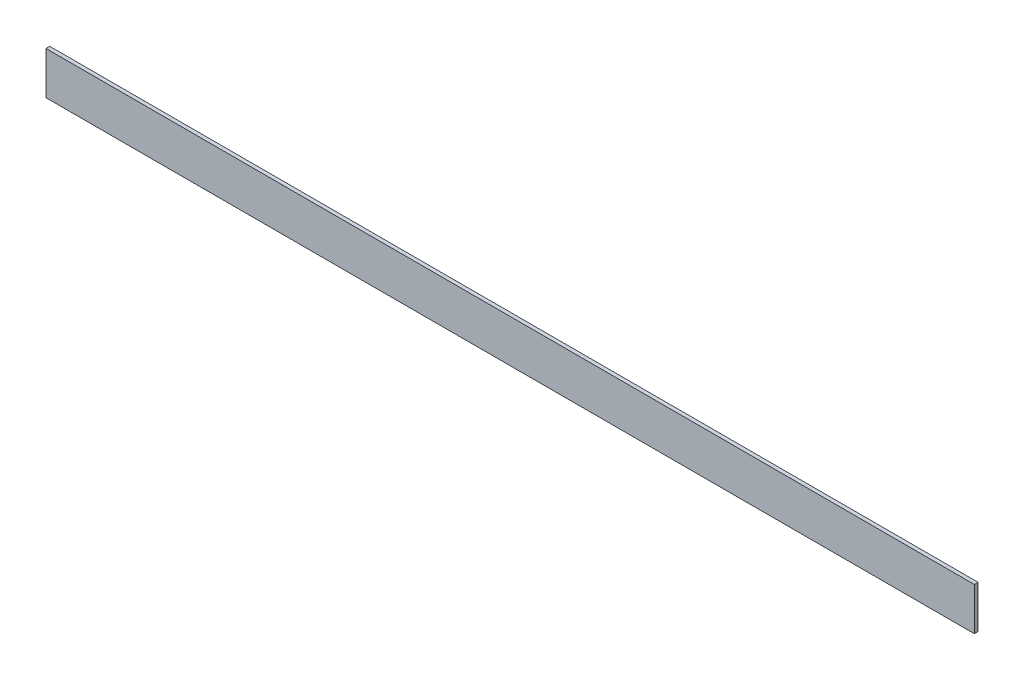
ISO-10303-21;
HEADER;
FILE_DESCRIPTION(('STEP AP214'),'2;1');
FILE_NAME('part.step','',(''),(''),'','','');
FILE_SCHEMA(('AUTOMOTIVE_DESIGN { 1 0 10303 214 1 1 1 1 }'));
ENDSEC;
DATA;
#1=APPLICATION_CONTEXT('core data for automotive mechanical design processes');
#2=APPLICATION_PROTOCOL_DEFINITION('international standard','automotive_design',2000,#1);
#3=PRODUCT_CONTEXT('',#1,'mechanical');
#4=PRODUCT('Part','Part','',(#3));
#5=PRODUCT_RELATED_PRODUCT_CATEGORY('part','',(#4));
#6=PRODUCT_DEFINITION_FORMATION('','',#4);
#7=PRODUCT_DEFINITION_CONTEXT('part definition',#1,'design');
#8=PRODUCT_DEFINITION('design','',#6,#7);
#9=PRODUCT_DEFINITION_SHAPE('','',#8);
#10=(LENGTH_UNIT() NAMED_UNIT(*) SI_UNIT(.MILLI.,.METRE.));
#11=(NAMED_UNIT(*) PLANE_ANGLE_UNIT() SI_UNIT($,.RADIAN.));
#12=(NAMED_UNIT(*) SI_UNIT($,.STERADIAN.) SOLID_ANGLE_UNIT());
#13=UNCERTAINTY_MEASURE_WITH_UNIT(LENGTH_MEASURE(1.E-05),#10,'distance_accuracy_value','');
#14=(GEOMETRIC_REPRESENTATION_CONTEXT(3) GLOBAL_UNCERTAINTY_ASSIGNED_CONTEXT((#13)) GLOBAL_UNIT_ASSIGNED_CONTEXT((#10,
#11,#12)) REPRESENTATION_CONTEXT('',''));
#15=CARTESIAN_POINT('',(0.,0.,0.));
#16=DIRECTION('',(0.,0.,1.));
#17=DIRECTION('',(1.,0.,0.));
#18=AXIS2_PLACEMENT_3D('',#15,#16,#17);
#19=CARTESIAN_POINT('',(2500.,115.,10.));
#20=DIRECTION('',(0.,-1.,0.));
#21=DIRECTION('',(1.,0.,0.));
#22=AXIS2_PLACEMENT_3D('',#19,#20,#21);
#23=PLANE('',#22);
#24=DIRECTION('',(-1.,0.,0.));
#25=VECTOR('',#24,1.);
#26=CARTESIAN_POINT('',(2500.,115.,0.));
#27=LINE('',#26,#25);
#28=CARTESIAN_POINT('',(2500.,115.,0.));
#29=VERTEX_POINT('',#28);
#30=CARTESIAN_POINT('',(0.,115.,0.));
#31=VERTEX_POINT('',#30);
#32=EDGE_CURVE('E107',#29,#31,#27,.T.);
#33=ORIENTED_EDGE('',*,*,#32,.T.);
#34=DIRECTION('',(0.,0.,-1.));
#35=VECTOR('',#34,1.);
#36=CARTESIAN_POINT('',(0.,115.,10.));
#37=LINE('',#36,#35);
#38=CARTESIAN_POINT('',(0.,115.,10.));
#39=VERTEX_POINT('',#38);
#40=EDGE_CURVE('E11',#39,#31,#37,.T.);
#41=ORIENTED_EDGE('',*,*,#40,.F.);
#42=DIRECTION('',(-1.,0.,0.));
#43=VECTOR('',#42,1.);
#44=CARTESIAN_POINT('',(2500.,115.,10.));
#45=LINE('',#44,#43);
#46=CARTESIAN_POINT('',(2500.,115.,10.));
#47=VERTEX_POINT('',#46);
#48=EDGE_CURVE('E91',#47,#39,#45,.T.);
#49=ORIENTED_EDGE('',*,*,#48,.F.);
#50=DIRECTION('',(0.,0.,-1.));
#51=VECTOR('',#50,1.);
#52=CARTESIAN_POINT('',(2500.,115.,10.));
#53=LINE('',#52,#51);
#54=EDGE_CURVE('E103',#47,#29,#53,.T.);
#55=ORIENTED_EDGE('',*,*,#54,.T.);
#56=EDGE_LOOP('',(#33,#41,#49,#55));
#57=FACE_BOUND('',#56,.T.);
#58=ADVANCED_FACE('F39',(#57),#23,.F.);
#59=CARTESIAN_POINT('',(0.,115.,10.));
#60=DIRECTION('',(1.,0.,0.));
#61=DIRECTION('',(0.,1.,0.));
#62=AXIS2_PLACEMENT_3D('',#59,#60,#61);
#63=PLANE('',#62);
#64=DIRECTION('',(0.,-1.,0.));
#65=VECTOR('',#64,1.);
#66=CARTESIAN_POINT('',(0.,115.,0.));
#67=LINE('',#66,#65);
#68=CARTESIAN_POINT('',(0.,0.,0.));
#69=VERTEX_POINT('',#68);
#70=EDGE_CURVE('E96',#31,#69,#67,.T.);
#71=ORIENTED_EDGE('',*,*,#70,.T.);
#72=DIRECTION('',(0.,0.,-1.));
#73=VECTOR('',#72,1.);
#74=CARTESIAN_POINT('',(0.,0.,10.));
#75=LINE('',#74,#73);
#76=CARTESIAN_POINT('',(0.,0.,10.));
#77=VERTEX_POINT('',#76);
#78=EDGE_CURVE('E48',#77,#69,#75,.T.);
#79=ORIENTED_EDGE('',*,*,#78,.F.);
#80=DIRECTION('',(0.,-1.,0.));
#81=VECTOR('',#80,1.);
#82=CARTESIAN_POINT('',(0.,115.,10.));
#83=LINE('',#82,#81);
#84=EDGE_CURVE('E86',#39,#77,#83,.T.);
#85=ORIENTED_EDGE('',*,*,#84,.F.);
#86=ORIENTED_EDGE('',*,*,#40,.T.);
#87=EDGE_LOOP('',(#71,#79,#85,#86));
#88=FACE_BOUND('',#87,.T.);
#89=ADVANCED_FACE('F95',(#88),#63,.F.);
#90=CARTESIAN_POINT('',(2500.,4.59242549680257E-13,10.));
#91=DIRECTION('',(0.,1.,0.));
#92=DIRECTION('',(-1.,0.,0.));
#93=AXIS2_PLACEMENT_3D('',#90,#91,#92);
#94=PLANE('',#93);
#95=DIRECTION('',(1.,0.,0.));
#96=VECTOR('',#95,1.);
#97=CARTESIAN_POINT('',(2500.,4.59242549680257E-13,0.));
#98=LINE('',#97,#96);
#99=CARTESIAN_POINT('',(2500.,4.59242549680257E-13,0.));
#100=VERTEX_POINT('',#99);
#101=EDGE_CURVE('E73',#69,#100,#98,.T.);
#102=ORIENTED_EDGE('',*,*,#101,.T.);
#103=DIRECTION('',(0.,0.,-1.));
#104=VECTOR('',#103,1.);
#105=CARTESIAN_POINT('',(2500.,4.59242549680257E-13,10.));
#106=LINE('',#105,#104);
#107=CARTESIAN_POINT('',(2500.,4.59242549680257E-13,10.));
#108=VERTEX_POINT('',#107);
#109=EDGE_CURVE('E98',#108,#100,#106,.T.);
#110=ORIENTED_EDGE('',*,*,#109,.F.);
#111=DIRECTION('',(1.,0.,0.));
#112=VECTOR('',#111,1.);
#113=CARTESIAN_POINT('',(2500.,4.59242549680257E-13,10.));
#114=LINE('',#113,#112);
#115=EDGE_CURVE('E89',#77,#108,#114,.T.);
#116=ORIENTED_EDGE('',*,*,#115,.F.);
#117=ORIENTED_EDGE('',*,*,#78,.T.);
#118=EDGE_LOOP('',(#102,#110,#116,#117));
#119=FACE_BOUND('',#118,.T.);
#120=ADVANCED_FACE('F99',(#119),#94,.F.);
#121=CARTESIAN_POINT('',(2500.,115.,10.));
#122=DIRECTION('',(-1.,0.,0.));
#123=DIRECTION('',(0.,0.,1.));
#124=AXIS2_PLACEMENT_3D('',#121,#122,#123);
#125=PLANE('',#124);
#126=DIRECTION('',(0.,1.,0.));
#127=VECTOR('',#126,1.);
#128=CARTESIAN_POINT('',(2500.,115.,0.));
#129=LINE('',#128,#127);
#130=EDGE_CURVE('E79',#100,#29,#129,.T.);
#131=ORIENTED_EDGE('',*,*,#130,.T.);
#132=ORIENTED_EDGE('',*,*,#54,.F.);
#133=DIRECTION('',(0.,1.,0.));
#134=VECTOR('',#133,1.);
#135=CARTESIAN_POINT('',(2500.,115.,10.));
#136=LINE('',#135,#134);
#137=EDGE_CURVE('E56',#108,#47,#136,.T.);
#138=ORIENTED_EDGE('',*,*,#137,.F.);
#139=ORIENTED_EDGE('',*,*,#109,.T.);
#140=EDGE_LOOP('',(#131,#132,#138,#139));
#141=FACE_BOUND('',#140,.T.);
#142=ADVANCED_FACE('F120',(#141),#125,.F.);
#143=CARTESIAN_POINT('',(0.,0.,10.));
#144=DIRECTION('',(0.,0.,1.));
#145=DIRECTION('',(1.,0.,0.));
#146=AXIS2_PLACEMENT_3D('',#143,#144,#145);
#147=PLANE('',#146);
#148=ORIENTED_EDGE('',*,*,#48,.T.);
#149=ORIENTED_EDGE('',*,*,#84,.T.);
#150=ORIENTED_EDGE('',*,*,#115,.T.);
#151=ORIENTED_EDGE('',*,*,#137,.T.);
#152=EDGE_LOOP('',(#148,#149,#150,#151));
#153=FACE_BOUND('',#152,.T.);
#154=ADVANCED_FACE('F87',(#153),#147,.T.);
#155=CARTESIAN_POINT('',(0.,0.,0.));
#156=DIRECTION('',(0.,0.,1.));
#157=DIRECTION('',(1.,0.,0.));
#158=AXIS2_PLACEMENT_3D('',#155,#156,#157);
#159=PLANE('',#158);
#160=ORIENTED_EDGE('',*,*,#32,.F.);
#161=ORIENTED_EDGE('',*,*,#130,.F.);
#162=ORIENTED_EDGE('',*,*,#101,.F.);
#163=ORIENTED_EDGE('',*,*,#70,.F.);
#164=EDGE_LOOP('',(#160,#161,#162,#163));
#165=FACE_BOUND('',#164,.T.);
#166=ADVANCED_FACE('F123',(#165),#159,.F.);
#167=CLOSED_SHELL('',(#58,#89,#120,#142,#154,#166));
#168=MANIFOLD_SOLID_BREP('B2',#167);
#169=ADVANCED_BREP_SHAPE_REPRESENTATION('',(#18,#168),#14);
#170=SHAPE_DEFINITION_REPRESENTATION(#9,#169);
ENDSEC;
END-ISO-10303-21;
